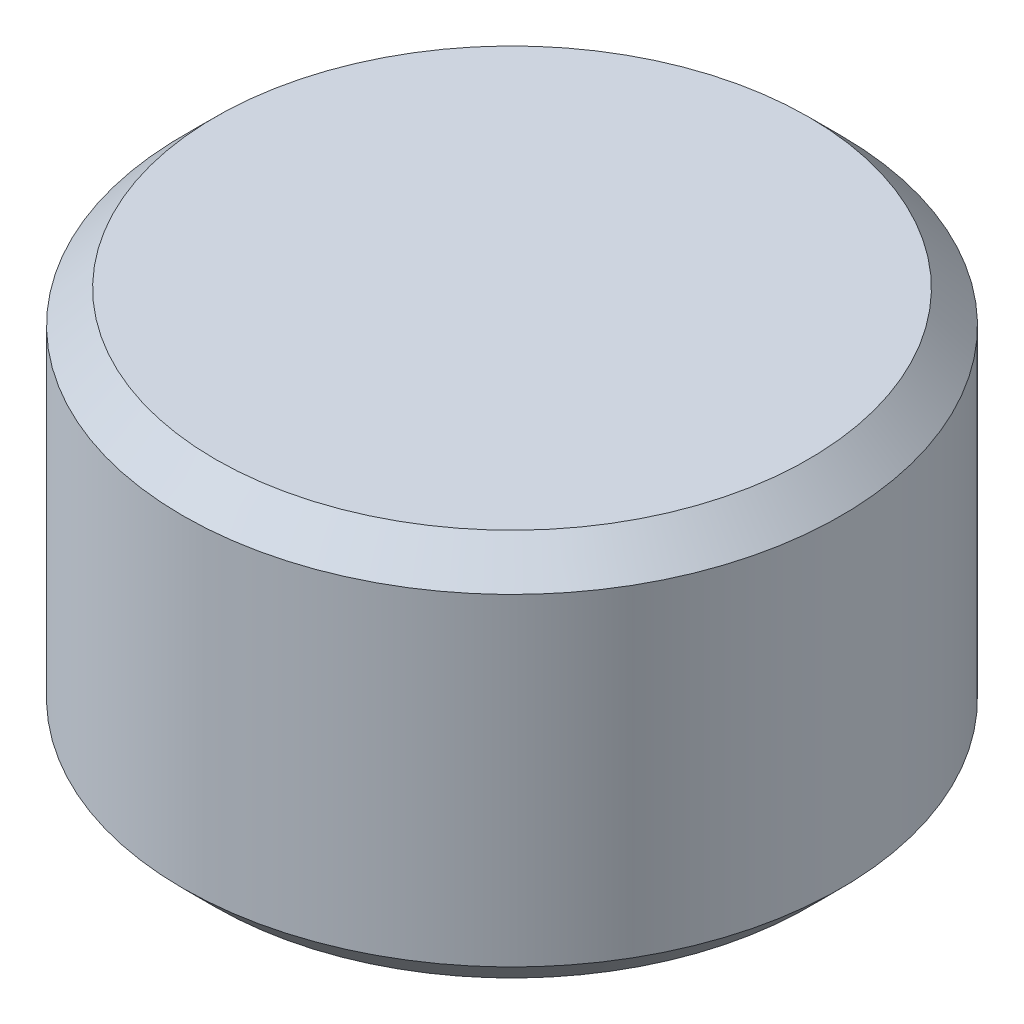
ISO-10303-21;
HEADER;
FILE_DESCRIPTION(('STEP AP214'),'2;1');
FILE_NAME('part.step','',(''),(''),'','','');
FILE_SCHEMA(('AUTOMOTIVE_DESIGN { 1 0 10303 214 1 1 1 1 }'));
ENDSEC;
DATA;
#1=APPLICATION_CONTEXT('core data for automotive mechanical design processes');
#2=APPLICATION_PROTOCOL_DEFINITION('international standard','automotive_design',2000,#1);
#3=PRODUCT_CONTEXT('',#1,'mechanical');
#4=PRODUCT('Part','Part','',(#3));
#5=PRODUCT_RELATED_PRODUCT_CATEGORY('part','',(#4));
#6=PRODUCT_DEFINITION_FORMATION('','',#4);
#7=PRODUCT_DEFINITION_CONTEXT('part definition',#1,'design');
#8=PRODUCT_DEFINITION('design','',#6,#7);
#9=PRODUCT_DEFINITION_SHAPE('','',#8);
#10=(LENGTH_UNIT() NAMED_UNIT(*) SI_UNIT(.MILLI.,.METRE.));
#11=(NAMED_UNIT(*) PLANE_ANGLE_UNIT() SI_UNIT($,.RADIAN.));
#12=(NAMED_UNIT(*) SI_UNIT($,.STERADIAN.) SOLID_ANGLE_UNIT());
#13=UNCERTAINTY_MEASURE_WITH_UNIT(LENGTH_MEASURE(1.E-05),#10,'distance_accuracy_value','');
#14=(GEOMETRIC_REPRESENTATION_CONTEXT(3) GLOBAL_UNCERTAINTY_ASSIGNED_CONTEXT((#13)) GLOBAL_UNIT_ASSIGNED_CONTEXT((#10,
#11,#12)) REPRESENTATION_CONTEXT('',''));
#15=CARTESIAN_POINT('',(0.,0.,0.));
#16=DIRECTION('',(0.,0.,1.));
#17=DIRECTION('',(1.,0.,0.));
#18=AXIS2_PLACEMENT_3D('',#15,#16,#17);
#19=CARTESIAN_POINT('',(0.,11.9,0.));
#20=DIRECTION('',(0.,-1.,0.));
#21=DIRECTION('',(0.,0.,-1.));
#22=AXIS2_PLACEMENT_3D('',#19,#20,#21);
#23=CYLINDRICAL_SURFACE('',#22,10.1);
#24=CARTESIAN_POINT('',(0.,10.9,0.));
#25=DIRECTION('',(0.,1.,0.));
#26=DIRECTION('',(0.,0.,1.));
#27=AXIS2_PLACEMENT_3D('',#24,#25,#26);
#28=CIRCLE('',#27,10.1);
#29=CARTESIAN_POINT('',(0.,10.9,10.1));
#30=VERTEX_POINT('',#29);
#31=EDGE_CURVE('E49',#30,#30,#28,.F.);
#32=ORIENTED_EDGE('',*,*,#31,.T.);
#33=EDGE_LOOP('',(#32));
#34=FACE_BOUND('',#33,.T.);
#35=CARTESIAN_POINT('',(0.,0.999999999999996,0.));
#36=DIRECTION('',(0.,1.,0.));
#37=DIRECTION('',(0.,0.,1.));
#38=AXIS2_PLACEMENT_3D('',#35,#36,#37);
#39=CIRCLE('',#38,10.1);
#40=CARTESIAN_POINT('',(0.,0.999999999999996,10.1));
#41=VERTEX_POINT('',#40);
#42=EDGE_CURVE('E53',#41,#41,#39,.T.);
#43=ORIENTED_EDGE('',*,*,#42,.T.);
#44=EDGE_LOOP('',(#43));
#45=FACE_BOUND('',#44,.T.);
#46=ADVANCED_FACE('F41',(#34,#45),#23,.T.);
#47=CARTESIAN_POINT('',(0.,11.9,0.));
#48=DIRECTION('',(0.,1.,0.));
#49=DIRECTION('',(0.,0.,1.));
#50=AXIS2_PLACEMENT_3D('',#47,#48,#49);
#51=PLANE('',#50);
#52=CARTESIAN_POINT('',(0.,11.9,0.));
#53=DIRECTION('',(0.,1.,0.));
#54=DIRECTION('',(0.,0.,1.));
#55=AXIS2_PLACEMENT_3D('',#52,#53,#54);
#56=CIRCLE('',#55,9.1);
#57=CARTESIAN_POINT('',(0.,11.9,9.1));
#58=VERTEX_POINT('',#57);
#59=EDGE_CURVE('E57',#58,#58,#56,.T.);
#60=ORIENTED_EDGE('',*,*,#59,.T.);
#61=EDGE_LOOP('',(#60));
#62=FACE_BOUND('',#61,.T.);
#63=ADVANCED_FACE('F84',(#62),#51,.T.);
#64=CARTESIAN_POINT('',(0.,0.,0.));
#65=DIRECTION('',(0.,1.,0.));
#66=DIRECTION('',(0.,0.,1.));
#67=AXIS2_PLACEMENT_3D('',#64,#65,#66);
#68=PLANE('',#67);
#69=CARTESIAN_POINT('',(0.,0.,0.));
#70=DIRECTION('',(0.,1.,0.));
#71=DIRECTION('',(0.,0.,1.));
#72=AXIS2_PLACEMENT_3D('',#69,#70,#71);
#73=CIRCLE('',#72,9.1);
#74=CARTESIAN_POINT('',(0.,0.,9.1));
#75=VERTEX_POINT('',#74);
#76=EDGE_CURVE('E10',#75,#75,#73,.F.);
#77=ORIENTED_EDGE('',*,*,#76,.T.);
#78=EDGE_LOOP('',(#77));
#79=FACE_BOUND('',#78,.T.);
#80=CARTESIAN_POINT('',(0.,0.,0.));
#81=DIRECTION('',(0.,1.,0.));
#82=DIRECTION('',(0.,0.,1.));
#83=AXIS2_PLACEMENT_3D('',#80,#81,#82);
#84=CIRCLE('',#83,1.6);
#85=CARTESIAN_POINT('',(0.,0.,1.6));
#86=VERTEX_POINT('',#85);
#87=EDGE_CURVE('E63',#86,#86,#84,.T.);
#88=ORIENTED_EDGE('',*,*,#87,.T.);
#89=EDGE_LOOP('',(#88));
#90=FACE_BOUND('',#89,.T.);
#91=ADVANCED_FACE('F82',(#79,#90),#68,.F.);
#92=CARTESIAN_POINT('',(0.,6.,0.));
#93=DIRECTION('',(0.,-1.,0.));
#94=DIRECTION('',(0.,0.,-1.));
#95=AXIS2_PLACEMENT_3D('',#92,#93,#94);
#96=CYLINDRICAL_SURFACE('',#95,1.6);
#97=CARTESIAN_POINT('',(0.,6.,0.));
#98=DIRECTION('',(0.,1.,0.));
#99=DIRECTION('',(0.,0.,1.));
#100=AXIS2_PLACEMENT_3D('',#97,#98,#99);
#101=CIRCLE('',#100,1.6);
#102=CARTESIAN_POINT('',(0.,6.,1.6));
#103=VERTEX_POINT('',#102);
#104=EDGE_CURVE('E62',#103,#103,#101,.T.);
#105=ORIENTED_EDGE('',*,*,#104,.T.);
#106=EDGE_LOOP('',(#105));
#107=FACE_BOUND('',#106,.T.);
#108=ORIENTED_EDGE('',*,*,#87,.F.);
#109=EDGE_LOOP('',(#108));
#110=FACE_BOUND('',#109,.T.);
#111=ADVANCED_FACE('F69',(#107,#110),#96,.F.);
#112=CARTESIAN_POINT('',(0.,6.,0.));
#113=DIRECTION('',(0.,1.,0.));
#114=DIRECTION('',(0.,0.,1.));
#115=AXIS2_PLACEMENT_3D('',#112,#113,#114);
#116=PLANE('',#115);
#117=ORIENTED_EDGE('',*,*,#104,.F.);
#118=EDGE_LOOP('',(#117));
#119=FACE_BOUND('',#118,.T.);
#120=ADVANCED_FACE('F72',(#119),#116,.F.);
#121=CARTESIAN_POINT('',(0.,11.9,0.));
#122=DIRECTION('',(0.,-1.,0.));
#123=DIRECTION('',(0.,0.,-1.));
#124=AXIS2_PLACEMENT_3D('',#121,#122,#123);
#125=CONICAL_SURFACE('',#124,9.1,0.785398163397447);
#126=ORIENTED_EDGE('',*,*,#31,.F.);
#127=EDGE_LOOP('',(#126));
#128=FACE_BOUND('',#127,.T.);
#129=ORIENTED_EDGE('',*,*,#59,.F.);
#130=EDGE_LOOP('',(#129));
#131=FACE_BOUND('',#130,.T.);
#132=ADVANCED_FACE('F74',(#128,#131),#125,.T.);
#133=CARTESIAN_POINT('',(0.,0.999999999999996,0.));
#134=DIRECTION('',(0.,1.,0.));
#135=DIRECTION('',(0.,0.,1.));
#136=AXIS2_PLACEMENT_3D('',#133,#134,#135);
#137=CONICAL_SURFACE('',#136,10.1,0.78539816339745);
#138=ORIENTED_EDGE('',*,*,#76,.F.);
#139=EDGE_LOOP('',(#138));
#140=FACE_BOUND('',#139,.T.);
#141=ORIENTED_EDGE('',*,*,#42,.F.);
#142=EDGE_LOOP('',(#141));
#143=FACE_BOUND('',#142,.T.);
#144=ADVANCED_FACE('F44',(#140,#143),#137,.T.);
#145=CLOSED_SHELL('',(#46,#63,#91,#111,#120,#132,#144));
#146=MANIFOLD_SOLID_BREP('B2',#145);
#147=ADVANCED_BREP_SHAPE_REPRESENTATION('',(#18,#146),#14);
#148=SHAPE_DEFINITION_REPRESENTATION(#9,#147);
ENDSEC;
END-ISO-10303-21;
